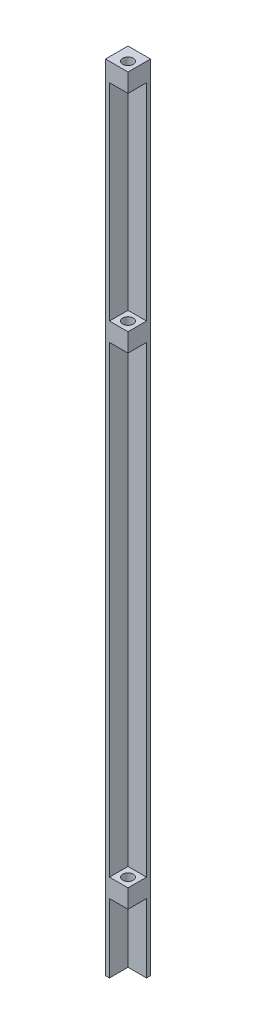
ISO-10303-21;
HEADER;
FILE_DESCRIPTION(('STEP AP214'),'2;1');
FILE_NAME('part.step','',(''),(''),'','','');
FILE_SCHEMA(('AUTOMOTIVE_DESIGN { 1 0 10303 214 1 1 1 1 }'));
ENDSEC;
DATA;
#1=APPLICATION_CONTEXT('core data for automotive mechanical design processes');
#2=APPLICATION_PROTOCOL_DEFINITION('international standard','automotive_design',2000,#1);
#3=PRODUCT_CONTEXT('',#1,'mechanical');
#4=PRODUCT('Part','Part','',(#3));
#5=PRODUCT_RELATED_PRODUCT_CATEGORY('part','',(#4));
#6=PRODUCT_DEFINITION_FORMATION('','',#4);
#7=PRODUCT_DEFINITION_CONTEXT('part definition',#1,'design');
#8=PRODUCT_DEFINITION('design','',#6,#7);
#9=PRODUCT_DEFINITION_SHAPE('','',#8);
#10=(LENGTH_UNIT() NAMED_UNIT(*) SI_UNIT(.MILLI.,.METRE.));
#11=(NAMED_UNIT(*) PLANE_ANGLE_UNIT() SI_UNIT($,.RADIAN.));
#12=(NAMED_UNIT(*) SI_UNIT($,.STERADIAN.) SOLID_ANGLE_UNIT());
#13=UNCERTAINTY_MEASURE_WITH_UNIT(LENGTH_MEASURE(1.E-05),#10,'distance_accuracy_value','');
#14=(GEOMETRIC_REPRESENTATION_CONTEXT(3) GLOBAL_UNCERTAINTY_ASSIGNED_CONTEXT((#13)) GLOBAL_UNIT_ASSIGNED_CONTEXT((#10,
#11,#12)) REPRESENTATION_CONTEXT('',''));
#15=CARTESIAN_POINT('',(0.,0.,0.));
#16=DIRECTION('',(0.,0.,1.));
#17=DIRECTION('',(1.,0.,0.));
#18=AXIS2_PLACEMENT_3D('',#15,#16,#17);
#19=CARTESIAN_POINT('',(1.5,215.,0.));
#20=DIRECTION('',(-1.,0.,0.));
#21=DIRECTION('',(0.,0.,1.));
#22=AXIS2_PLACEMENT_3D('',#19,#20,#21);
#23=PLANE('',#22);
#24=DIRECTION('',(0.,0.,1.));
#25=VECTOR('',#24,1.);
#26=CARTESIAN_POINT('',(1.5,293.,-7.));
#27=LINE('',#26,#25);
#28=CARTESIAN_POINT('',(1.5,293.,-7.));
#29=VERTEX_POINT('',#28);
#30=CARTESIAN_POINT('',(1.5,293.,0.));
#31=VERTEX_POINT('',#30);
#32=EDGE_CURVE('E53',#29,#31,#27,.T.);
#33=ORIENTED_EDGE('',*,*,#32,.T.);
#34=DIRECTION('',(0.,1.,0.));
#35=VECTOR('',#34,1.);
#36=CARTESIAN_POINT('',(1.5,215.,0.));
#37=LINE('',#36,#35);
#38=CARTESIAN_POINT('',(1.5,215.,0.));
#39=VERTEX_POINT('',#38);
#40=EDGE_CURVE('E165',#39,#31,#37,.T.);
#41=ORIENTED_EDGE('',*,*,#40,.F.);
#42=DIRECTION('',(0.,0.,1.));
#43=VECTOR('',#42,1.);
#44=CARTESIAN_POINT('',(1.5,215.,0.));
#45=LINE('',#44,#43);
#46=CARTESIAN_POINT('',(1.5,215.,-7.));
#47=VERTEX_POINT('',#46);
#48=EDGE_CURVE('E177',#47,#39,#45,.T.);
#49=ORIENTED_EDGE('',*,*,#48,.F.);
#50=DIRECTION('',(0.,1.,0.));
#51=VECTOR('',#50,1.);
#52=CARTESIAN_POINT('',(1.5,215.,-7.));
#53=LINE('',#52,#51);
#54=EDGE_CURVE('E183',#47,#29,#53,.T.);
#55=ORIENTED_EDGE('',*,*,#54,.T.);
#56=EDGE_LOOP('',(#33,#41,#49,#55));
#57=FACE_BOUND('',#56,.T.);
#58=ADVANCED_FACE('F37',(#57),#23,.F.);
#59=CARTESIAN_POINT('',(8.5,215.,-7.));
#60=DIRECTION('',(0.,0.,-1.));
#61=DIRECTION('',(-1.,0.,0.));
#62=AXIS2_PLACEMENT_3D('',#59,#60,#61);
#63=PLANE('',#62);
#64=DIRECTION('',(-1.,0.,0.));
#65=VECTOR('',#64,1.);
#66=CARTESIAN_POINT('',(1.5,293.,-7.));
#67=LINE('',#66,#65);
#68=CARTESIAN_POINT('',(8.5,293.,-7.));
#69=VERTEX_POINT('',#68);
#70=EDGE_CURVE('E156',#69,#29,#67,.T.);
#71=ORIENTED_EDGE('',*,*,#70,.T.);
#72=ORIENTED_EDGE('',*,*,#54,.F.);
#73=DIRECTION('',(-1.,0.,0.));
#74=VECTOR('',#73,1.);
#75=CARTESIAN_POINT('',(8.5,215.,-7.));
#76=LINE('',#75,#74);
#77=CARTESIAN_POINT('',(8.5,215.,-7.));
#78=VERTEX_POINT('',#77);
#79=EDGE_CURVE('E174',#78,#47,#76,.T.);
#80=ORIENTED_EDGE('',*,*,#79,.F.);
#81=DIRECTION('',(0.,1.,0.));
#82=VECTOR('',#81,1.);
#83=CARTESIAN_POINT('',(8.5,215.,-7.));
#84=LINE('',#83,#82);
#85=EDGE_CURVE('E61',#78,#69,#84,.T.);
#86=ORIENTED_EDGE('',*,*,#85,.T.);
#87=EDGE_LOOP('',(#71,#72,#80,#86));
#88=FACE_BOUND('',#87,.T.);
#89=ADVANCED_FACE('F320',(#88),#63,.F.);
#90=CARTESIAN_POINT('',(5.,218.,-3.5));
#91=DIRECTION('',(0.,-1.,0.));
#92=DIRECTION('',(0.,0.,-1.));
#93=AXIS2_PLACEMENT_3D('',#90,#91,#92);
#94=CYLINDRICAL_SURFACE('',#93,2.);
#95=CARTESIAN_POINT('',(5.,208.,-3.5));
#96=DIRECTION('',(0.,-1.,0.));
#97=DIRECTION('',(0.,0.,-1.));
#98=AXIS2_PLACEMENT_3D('',#95,#96,#97);
#99=CIRCLE('',#98,2.);
#100=CARTESIAN_POINT('',(5.,208.,-5.5));
#101=VERTEX_POINT('',#100);
#102=EDGE_CURVE('E212',#101,#101,#99,.T.);
#103=ORIENTED_EDGE('',*,*,#102,.T.);
#104=EDGE_LOOP('',(#103));
#105=FACE_BOUND('',#104,.T.);
#106=CARTESIAN_POINT('',(5.,215.,-3.5));
#107=DIRECTION('',(0.,1.,0.));
#108=DIRECTION('',(0.,0.,1.));
#109=AXIS2_PLACEMENT_3D('',#106,#107,#108);
#110=CIRCLE('',#109,2.);
#111=CARTESIAN_POINT('',(5.,215.,-1.5));
#112=VERTEX_POINT('',#111);
#113=EDGE_CURVE('E41',#112,#112,#110,.F.);
#114=ORIENTED_EDGE('',*,*,#113,.F.);
#115=EDGE_LOOP('',(#114));
#116=FACE_BOUND('',#115,.T.);
#117=ADVANCED_FACE('F325',(#105,#116),#94,.F.);
#118=CARTESIAN_POINT('',(0.,300.,0.));
#119=DIRECTION('',(1.,0.,0.));
#120=DIRECTION('',(0.,0.,-1.));
#121=AXIS2_PLACEMENT_3D('',#118,#119,#120);
#122=PLANE('',#121);
#123=DIRECTION('',(0.,0.,1.));
#124=VECTOR('',#123,1.);
#125=CARTESIAN_POINT('',(0.,0.,0.));
#126=LINE('',#125,#124);
#127=CARTESIAN_POINT('',(0.,0.,-8.5));
#128=VERTEX_POINT('',#127);
#129=CARTESIAN_POINT('',(0.,0.,0.));
#130=VERTEX_POINT('',#129);
#131=EDGE_CURVE('E246',#128,#130,#126,.T.);
#132=ORIENTED_EDGE('',*,*,#131,.T.);
#133=DIRECTION('',(0.,-1.,0.));
#134=VECTOR('',#133,1.);
#135=CARTESIAN_POINT('',(0.,300.,0.));
#136=LINE('',#135,#134);
#137=CARTESIAN_POINT('',(0.,300.,0.));
#138=VERTEX_POINT('',#137);
#139=EDGE_CURVE('E11',#138,#130,#136,.T.);
#140=ORIENTED_EDGE('',*,*,#139,.F.);
#141=DIRECTION('',(0.,0.,1.));
#142=VECTOR('',#141,1.);
#143=CARTESIAN_POINT('',(0.,300.,0.));
#144=LINE('',#143,#142);
#145=CARTESIAN_POINT('',(0.,300.,-8.5));
#146=VERTEX_POINT('',#145);
#147=EDGE_CURVE('E250',#146,#138,#144,.T.);
#148=ORIENTED_EDGE('',*,*,#147,.F.);
#149=DIRECTION('',(0.,-1.,0.));
#150=VECTOR('',#149,1.);
#151=CARTESIAN_POINT('',(0.,300.,-8.5));
#152=LINE('',#151,#150);
#153=EDGE_CURVE('E259',#146,#128,#152,.T.);
#154=ORIENTED_EDGE('',*,*,#153,.T.);
#155=EDGE_LOOP('',(#132,#140,#148,#154));
#156=FACE_BOUND('',#155,.T.);
#157=ADVANCED_FACE('F39',(#156),#122,.F.);
#158=CARTESIAN_POINT('',(0.,300.,0.));
#159=DIRECTION('',(0.,0.,-1.));
#160=DIRECTION('',(-1.,0.,0.));
#161=AXIS2_PLACEMENT_3D('',#158,#159,#160);
#162=PLANE('',#161);
#163=DIRECTION('',(1.,0.,0.));
#164=VECTOR('',#163,1.);
#165=CARTESIAN_POINT('',(8.5,215.,0.));
#166=LINE('',#165,#164);
#167=CARTESIAN_POINT('',(8.5,215.,0.));
#168=VERTEX_POINT('',#167);
#169=EDGE_CURVE('E180',#39,#168,#166,.T.);
#170=ORIENTED_EDGE('',*,*,#169,.F.);
#171=ORIENTED_EDGE('',*,*,#40,.T.);
#172=DIRECTION('',(1.,0.,0.));
#173=VECTOR('',#172,1.);
#174=CARTESIAN_POINT('',(1.5,293.,0.));
#175=LINE('',#174,#173);
#176=CARTESIAN_POINT('',(8.5,293.,0.));
#177=VERTEX_POINT('',#176);
#178=EDGE_CURVE('E161',#31,#177,#175,.T.);
#179=ORIENTED_EDGE('',*,*,#178,.T.);
#180=DIRECTION('',(0.,1.,0.));
#181=VECTOR('',#180,1.);
#182=CARTESIAN_POINT('',(8.5,293.,0.));
#183=LINE('',#182,#181);
#184=CARTESIAN_POINT('',(8.5,300.,0.));
#185=VERTEX_POINT('',#184);
#186=EDGE_CURVE('E146',#177,#185,#183,.T.);
#187=ORIENTED_EDGE('',*,*,#186,.T.);
#188=DIRECTION('',(1.,0.,0.));
#189=VECTOR('',#188,1.);
#190=CARTESIAN_POINT('',(0.,300.,0.));
#191=LINE('',#190,#189);
#192=EDGE_CURVE('E253',#138,#185,#191,.T.);
#193=ORIENTED_EDGE('',*,*,#192,.F.);
#194=ORIENTED_EDGE('',*,*,#139,.T.);
#195=DIRECTION('',(1.,0.,0.));
#196=VECTOR('',#195,1.);
#197=CARTESIAN_POINT('',(0.,0.,0.));
#198=LINE('',#197,#196);
#199=CARTESIAN_POINT('',(1.5,0.,0.));
#200=VERTEX_POINT('',#199);
#201=EDGE_CURVE('E262',#130,#200,#198,.T.);
#202=ORIENTED_EDGE('',*,*,#201,.T.);
#203=DIRECTION('',(0.,-1.,0.));
#204=VECTOR('',#203,1.);
#205=CARTESIAN_POINT('',(1.5,26.,0.));
#206=LINE('',#205,#204);
#207=CARTESIAN_POINT('',(1.5,26.,0.));
#208=VERTEX_POINT('',#207);
#209=EDGE_CURVE('E205',#208,#200,#206,.T.);
#210=ORIENTED_EDGE('',*,*,#209,.F.);
#211=DIRECTION('',(-1.,0.,0.));
#212=VECTOR('',#211,1.);
#213=CARTESIAN_POINT('',(8.5,26.,0.));
#214=LINE('',#213,#212);
#215=CARTESIAN_POINT('',(8.5,26.,0.));
#216=VERTEX_POINT('',#215);
#217=EDGE_CURVE('E195',#216,#208,#214,.T.);
#218=ORIENTED_EDGE('',*,*,#217,.F.);
#219=DIRECTION('',(0.,-1.,0.));
#220=VECTOR('',#219,1.);
#221=CARTESIAN_POINT('',(8.5,300.,0.));
#222=LINE('',#221,#220);
#223=CARTESIAN_POINT('',(8.5,33.,0.));
#224=VERTEX_POINT('',#223);
#225=EDGE_CURVE('E273',#224,#216,#222,.T.);
#226=ORIENTED_EDGE('',*,*,#225,.F.);
#227=DIRECTION('',(-1.,0.,0.));
#228=VECTOR('',#227,1.);
#229=CARTESIAN_POINT('',(8.5,33.,0.));
#230=LINE('',#229,#228);
#231=CARTESIAN_POINT('',(1.5,33.,0.));
#232=VERTEX_POINT('',#231);
#233=EDGE_CURVE('E235',#224,#232,#230,.T.);
#234=ORIENTED_EDGE('',*,*,#233,.T.);
#235=DIRECTION('',(0.,-1.,0.));
#236=VECTOR('',#235,1.);
#237=CARTESIAN_POINT('',(1.5,208.,0.));
#238=LINE('',#237,#236);
#239=CARTESIAN_POINT('',(1.5,208.,0.));
#240=VERTEX_POINT('',#239);
#241=EDGE_CURVE('E232',#240,#232,#238,.T.);
#242=ORIENTED_EDGE('',*,*,#241,.F.);
#243=DIRECTION('',(-1.,0.,0.));
#244=VECTOR('',#243,1.);
#245=CARTESIAN_POINT('',(8.5,208.,0.));
#246=LINE('',#245,#244);
#247=CARTESIAN_POINT('',(8.5,208.,0.));
#248=VERTEX_POINT('',#247);
#249=EDGE_CURVE('E222',#248,#240,#246,.T.);
#250=ORIENTED_EDGE('',*,*,#249,.F.);
#251=EDGE_CURVE('E46',#168,#248,#222,.T.);
#252=ORIENTED_EDGE('',*,*,#251,.F.);
#253=EDGE_LOOP('',(#170,#171,#179,#187,#193,#194,#202,#210,#218,#226,#234,#242,#250,#252));
#254=FACE_BOUND('',#253,.T.);
#255=ADVANCED_FACE('F164',(#254),#162,.F.);
#256=CARTESIAN_POINT('',(8.5,300.,0.));
#257=DIRECTION('',(-1.,0.,0.));
#258=DIRECTION('',(0.,0.,1.));
#259=AXIS2_PLACEMENT_3D('',#256,#257,#258);
#260=PLANE('',#259);
#261=DIRECTION('',(0.,0.,-1.));
#262=VECTOR('',#261,1.);
#263=CARTESIAN_POINT('',(8.5,300.,0.));
#264=LINE('',#263,#262);
#265=CARTESIAN_POINT('',(8.5,300.,-8.5));
#266=VERTEX_POINT('',#265);
#267=EDGE_CURVE('E152',#185,#266,#264,.T.);
#268=ORIENTED_EDGE('',*,*,#267,.F.);
#269=ORIENTED_EDGE('',*,*,#186,.F.);
#270=DIRECTION('',(0.,0.,-1.));
#271=VECTOR('',#270,1.);
#272=CARTESIAN_POINT('',(8.5,293.,-7.));
#273=LINE('',#272,#271);
#274=EDGE_CURVE('E149',#177,#69,#273,.T.);
#275=ORIENTED_EDGE('',*,*,#274,.T.);
#276=ORIENTED_EDGE('',*,*,#85,.F.);
#277=DIRECTION('',(0.,0.,-1.));
#278=VECTOR('',#277,1.);
#279=CARTESIAN_POINT('',(8.5,215.,0.));
#280=LINE('',#279,#278);
#281=EDGE_CURVE('E155',#168,#78,#280,.T.);
#282=ORIENTED_EDGE('',*,*,#281,.F.);
#283=ORIENTED_EDGE('',*,*,#251,.T.);
#284=DIRECTION('',(0.,0.,1.));
#285=VECTOR('',#284,1.);
#286=CARTESIAN_POINT('',(8.5,208.,0.));
#287=LINE('',#286,#285);
#288=CARTESIAN_POINT('',(8.5,208.,-7.));
#289=VERTEX_POINT('',#288);
#290=EDGE_CURVE('E219',#289,#248,#287,.T.);
#291=ORIENTED_EDGE('',*,*,#290,.F.);
#292=DIRECTION('',(0.,-1.,0.));
#293=VECTOR('',#292,1.);
#294=CARTESIAN_POINT('',(8.5,208.,-7.));
#295=LINE('',#294,#293);
#296=CARTESIAN_POINT('',(8.5,33.,-7.));
#297=VERTEX_POINT('',#296);
#298=EDGE_CURVE('E243',#289,#297,#295,.T.);
#299=ORIENTED_EDGE('',*,*,#298,.T.);
#300=DIRECTION('',(0.,0.,1.));
#301=VECTOR('',#300,1.);
#302=CARTESIAN_POINT('',(8.5,33.,0.));
#303=LINE('',#302,#301);
#304=EDGE_CURVE('E218',#297,#224,#303,.T.);
#305=ORIENTED_EDGE('',*,*,#304,.T.);
#306=ORIENTED_EDGE('',*,*,#225,.T.);
#307=DIRECTION('',(0.,0.,1.));
#308=VECTOR('',#307,1.);
#309=CARTESIAN_POINT('',(8.5,26.,0.));
#310=LINE('',#309,#308);
#311=CARTESIAN_POINT('',(8.5,26.,-7.));
#312=VERTEX_POINT('',#311);
#313=EDGE_CURVE('E193',#312,#216,#310,.T.);
#314=ORIENTED_EDGE('',*,*,#313,.F.);
#315=DIRECTION('',(0.,-1.,0.));
#316=VECTOR('',#315,1.);
#317=CARTESIAN_POINT('',(8.5,26.,-7.));
#318=LINE('',#317,#316);
#319=CARTESIAN_POINT('',(8.5,0.,-7.));
#320=VERTEX_POINT('',#319);
#321=EDGE_CURVE('E209',#312,#320,#318,.T.);
#322=ORIENTED_EDGE('',*,*,#321,.T.);
#323=DIRECTION('',(0.,0.,-1.));
#324=VECTOR('',#323,1.);
#325=CARTESIAN_POINT('',(8.5,0.,0.));
#326=LINE('',#325,#324);
#327=CARTESIAN_POINT('',(8.5,0.,-8.5));
#328=VERTEX_POINT('',#327);
#329=EDGE_CURVE('E265',#320,#328,#326,.T.);
#330=ORIENTED_EDGE('',*,*,#329,.T.);
#331=DIRECTION('',(0.,-1.,0.));
#332=VECTOR('',#331,1.);
#333=CARTESIAN_POINT('',(8.5,300.,-8.5));
#334=LINE('',#333,#332);
#335=EDGE_CURVE('E270',#266,#328,#334,.T.);
#336=ORIENTED_EDGE('',*,*,#335,.F.);
#337=EDGE_LOOP('',(#268,#269,#275,#276,#282,#283,#291,#299,#305,#306,#314,#322,#330,#336));
#338=FACE_BOUND('',#337,.T.);
#339=ADVANCED_FACE('F148',(#338),#260,.F.);
#340=CARTESIAN_POINT('',(0.,300.,-8.5));
#341=DIRECTION('',(0.,0.,1.));
#342=DIRECTION('',(1.,0.,0.));
#343=AXIS2_PLACEMENT_3D('',#340,#341,#342);
#344=PLANE('',#343);
#345=DIRECTION('',(-1.,0.,0.));
#346=VECTOR('',#345,1.);
#347=CARTESIAN_POINT('',(0.,0.,-8.5));
#348=LINE('',#347,#346);
#349=EDGE_CURVE('E254',#328,#128,#348,.T.);
#350=ORIENTED_EDGE('',*,*,#349,.T.);
#351=ORIENTED_EDGE('',*,*,#153,.F.);
#352=DIRECTION('',(-1.,0.,0.));
#353=VECTOR('',#352,1.);
#354=CARTESIAN_POINT('',(0.,300.,-8.5));
#355=LINE('',#354,#353);
#356=EDGE_CURVE('E257',#266,#146,#355,.T.);
#357=ORIENTED_EDGE('',*,*,#356,.F.);
#358=ORIENTED_EDGE('',*,*,#335,.T.);
#359=EDGE_LOOP('',(#350,#351,#357,#358));
#360=FACE_BOUND('',#359,.T.);
#361=ADVANCED_FACE('F297',(#360),#344,.F.);
#362=CARTESIAN_POINT('',(0.,300.,0.));
#363=DIRECTION('',(0.,-1.,0.));
#364=DIRECTION('',(0.,0.,-1.));
#365=AXIS2_PLACEMENT_3D('',#362,#363,#364);
#366=PLANE('',#365);
#367=ORIENTED_EDGE('',*,*,#192,.T.);
#368=ORIENTED_EDGE('',*,*,#267,.T.);
#369=ORIENTED_EDGE('',*,*,#356,.T.);
#370=ORIENTED_EDGE('',*,*,#147,.T.);
#371=EDGE_LOOP('',(#367,#368,#369,#370));
#372=FACE_BOUND('',#371,.T.);
#373=CARTESIAN_POINT('',(5.,300.,-3.5));
#374=DIRECTION('',(0.,1.,0.));
#375=DIRECTION('',(0.,0.,1.));
#376=AXIS2_PLACEMENT_3D('',#373,#374,#375);
#377=CIRCLE('',#376,2.);
#378=CARTESIAN_POINT('',(5.,300.,-1.5));
#379=VERTEX_POINT('',#378);
#380=EDGE_CURVE('E440',#379,#379,#377,.T.);
#381=ORIENTED_EDGE('',*,*,#380,.F.);
#382=EDGE_LOOP('',(#381));
#383=FACE_BOUND('',#382,.T.);
#384=ADVANCED_FACE('F303',(#372,#383),#366,.F.);
#385=CARTESIAN_POINT('',(0.,0.,0.));
#386=DIRECTION('',(0.,-1.,0.));
#387=DIRECTION('',(0.,0.,-1.));
#388=AXIS2_PLACEMENT_3D('',#385,#386,#387);
#389=PLANE('',#388);
#390=DIRECTION('',(1.,0.,0.));
#391=VECTOR('',#390,1.);
#392=CARTESIAN_POINT('',(8.5,0.,-7.));
#393=LINE('',#392,#391);
#394=CARTESIAN_POINT('',(1.5,0.,-7.));
#395=VERTEX_POINT('',#394);
#396=EDGE_CURVE('E196',#395,#320,#393,.T.);
#397=ORIENTED_EDGE('',*,*,#396,.F.);
#398=DIRECTION('',(0.,0.,-1.));
#399=VECTOR('',#398,1.);
#400=CARTESIAN_POINT('',(1.5,0.,0.));
#401=LINE('',#400,#399);
#402=EDGE_CURVE('E192',#200,#395,#401,.T.);
#403=ORIENTED_EDGE('',*,*,#402,.F.);
#404=ORIENTED_EDGE('',*,*,#201,.F.);
#405=ORIENTED_EDGE('',*,*,#131,.F.);
#406=ORIENTED_EDGE('',*,*,#349,.F.);
#407=ORIENTED_EDGE('',*,*,#329,.F.);
#408=EDGE_LOOP('',(#397,#403,#404,#405,#406,#407));
#409=FACE_BOUND('',#408,.T.);
#410=ADVANCED_FACE('F292',(#409),#389,.T.);
#411=CARTESIAN_POINT('',(8.5,208.,-7.));
#412=DIRECTION('',(0.,0.,-1.));
#413=DIRECTION('',(-1.,0.,0.));
#414=AXIS2_PLACEMENT_3D('',#411,#412,#413);
#415=PLANE('',#414);
#416=DIRECTION('',(1.,0.,0.));
#417=VECTOR('',#416,1.);
#418=CARTESIAN_POINT('',(8.5,33.,-7.));
#419=LINE('',#418,#417);
#420=CARTESIAN_POINT('',(1.5,33.,-7.));
#421=VERTEX_POINT('',#420);
#422=EDGE_CURVE('E223',#421,#297,#419,.T.);
#423=ORIENTED_EDGE('',*,*,#422,.T.);
#424=ORIENTED_EDGE('',*,*,#298,.F.);
#425=DIRECTION('',(1.,0.,0.));
#426=VECTOR('',#425,1.);
#427=CARTESIAN_POINT('',(8.5,208.,-7.));
#428=LINE('',#427,#426);
#429=CARTESIAN_POINT('',(1.5,208.,-7.));
#430=VERTEX_POINT('',#429);
#431=EDGE_CURVE('E229',#430,#289,#428,.T.);
#432=ORIENTED_EDGE('',*,*,#431,.F.);
#433=DIRECTION('',(0.,-1.,0.));
#434=VECTOR('',#433,1.);
#435=CARTESIAN_POINT('',(1.5,208.,-7.));
#436=LINE('',#435,#434);
#437=EDGE_CURVE('E247',#430,#421,#436,.T.);
#438=ORIENTED_EDGE('',*,*,#437,.T.);
#439=EDGE_LOOP('',(#423,#424,#432,#438));
#440=FACE_BOUND('',#439,.T.);
#441=ADVANCED_FACE('F348',(#440),#415,.F.);
#442=CARTESIAN_POINT('',(1.5,208.,0.));
#443=DIRECTION('',(-1.,0.,0.));
#444=DIRECTION('',(0.,0.,1.));
#445=AXIS2_PLACEMENT_3D('',#442,#443,#444);
#446=PLANE('',#445);
#447=DIRECTION('',(0.,0.,-1.));
#448=VECTOR('',#447,1.);
#449=CARTESIAN_POINT('',(1.5,33.,0.));
#450=LINE('',#449,#448);
#451=EDGE_CURVE('E238',#232,#421,#450,.T.);
#452=ORIENTED_EDGE('',*,*,#451,.T.);
#453=ORIENTED_EDGE('',*,*,#437,.F.);
#454=DIRECTION('',(0.,0.,-1.));
#455=VECTOR('',#454,1.);
#456=CARTESIAN_POINT('',(1.5,208.,0.));
#457=LINE('',#456,#455);
#458=EDGE_CURVE('E226',#240,#430,#457,.T.);
#459=ORIENTED_EDGE('',*,*,#458,.F.);
#460=ORIENTED_EDGE('',*,*,#241,.T.);
#461=EDGE_LOOP('',(#452,#453,#459,#460));
#462=FACE_BOUND('',#461,.T.);
#463=ADVANCED_FACE('F353',(#462),#446,.F.);
#464=CARTESIAN_POINT('',(0.,208.,0.));
#465=DIRECTION('',(0.,1.,0.));
#466=DIRECTION('',(0.,0.,1.));
#467=AXIS2_PLACEMENT_3D('',#464,#465,#466);
#468=PLANE('',#467);
#469=ORIENTED_EDGE('',*,*,#102,.F.);
#470=EDGE_LOOP('',(#469));
#471=FACE_BOUND('',#470,.T.);
#472=ORIENTED_EDGE('',*,*,#290,.T.);
#473=ORIENTED_EDGE('',*,*,#249,.T.);
#474=ORIENTED_EDGE('',*,*,#458,.T.);
#475=ORIENTED_EDGE('',*,*,#431,.T.);
#476=EDGE_LOOP('',(#472,#473,#474,#475));
#477=FACE_BOUND('',#476,.T.);
#478=ADVANCED_FACE('F343',(#471,#477),#468,.F.);
#479=CARTESIAN_POINT('',(0.,33.,0.));
#480=DIRECTION('',(0.,1.,0.));
#481=DIRECTION('',(0.,0.,1.));
#482=AXIS2_PLACEMENT_3D('',#479,#480,#481);
#483=PLANE('',#482);
#484=CARTESIAN_POINT('',(5.,33.,-3.5));
#485=DIRECTION('',(0.,1.,0.));
#486=DIRECTION('',(0.,0.,1.));
#487=AXIS2_PLACEMENT_3D('',#484,#485,#486);
#488=CIRCLE('',#487,2.);
#489=CARTESIAN_POINT('',(5.,33.,-5.5));
#490=VERTEX_POINT('',#489);
#491=EDGE_CURVE('E189',#490,#490,#488,.T.);
#492=ORIENTED_EDGE('',*,*,#491,.F.);
#493=EDGE_LOOP('',(#492));
#494=FACE_BOUND('',#493,.T.);
#495=ORIENTED_EDGE('',*,*,#304,.F.);
#496=ORIENTED_EDGE('',*,*,#422,.F.);
#497=ORIENTED_EDGE('',*,*,#451,.F.);
#498=ORIENTED_EDGE('',*,*,#233,.F.);
#499=EDGE_LOOP('',(#495,#496,#497,#498));
#500=FACE_BOUND('',#499,.T.);
#501=ADVANCED_FACE('F316',(#494,#500),#483,.T.);
#502=CARTESIAN_POINT('',(8.5,26.,-7.));
#503=DIRECTION('',(0.,0.,-1.));
#504=DIRECTION('',(-1.,0.,0.));
#505=AXIS2_PLACEMENT_3D('',#502,#503,#504);
#506=PLANE('',#505);
#507=ORIENTED_EDGE('',*,*,#396,.T.);
#508=ORIENTED_EDGE('',*,*,#321,.F.);
#509=DIRECTION('',(1.,0.,0.));
#510=VECTOR('',#509,1.);
#511=CARTESIAN_POINT('',(8.5,26.,-7.));
#512=LINE('',#511,#510);
#513=CARTESIAN_POINT('',(1.5,26.,-7.));
#514=VERTEX_POINT('',#513);
#515=EDGE_CURVE('E202',#514,#312,#512,.T.);
#516=ORIENTED_EDGE('',*,*,#515,.F.);
#517=DIRECTION('',(0.,-1.,0.));
#518=VECTOR('',#517,1.);
#519=CARTESIAN_POINT('',(1.5,26.,-7.));
#520=LINE('',#519,#518);
#521=EDGE_CURVE('E213',#514,#395,#520,.T.);
#522=ORIENTED_EDGE('',*,*,#521,.T.);
#523=EDGE_LOOP('',(#507,#508,#516,#522));
#524=FACE_BOUND('',#523,.T.);
#525=ADVANCED_FACE('F287',(#524),#506,.F.);
#526=CARTESIAN_POINT('',(1.5,26.,0.));
#527=DIRECTION('',(-1.,0.,0.));
#528=DIRECTION('',(0.,0.,1.));
#529=AXIS2_PLACEMENT_3D('',#526,#527,#528);
#530=PLANE('',#529);
#531=ORIENTED_EDGE('',*,*,#402,.T.);
#532=ORIENTED_EDGE('',*,*,#521,.F.);
#533=DIRECTION('',(0.,0.,-1.));
#534=VECTOR('',#533,1.);
#535=CARTESIAN_POINT('',(1.5,26.,0.));
#536=LINE('',#535,#534);
#537=EDGE_CURVE('E199',#208,#514,#536,.T.);
#538=ORIENTED_EDGE('',*,*,#537,.F.);
#539=ORIENTED_EDGE('',*,*,#209,.T.);
#540=EDGE_LOOP('',(#531,#532,#538,#539));
#541=FACE_BOUND('',#540,.T.);
#542=ADVANCED_FACE('F306',(#541),#530,.F.);
#543=CARTESIAN_POINT('',(0.,26.,0.));
#544=DIRECTION('',(0.,1.,0.));
#545=DIRECTION('',(0.,0.,1.));
#546=AXIS2_PLACEMENT_3D('',#543,#544,#545);
#547=PLANE('',#546);
#548=CARTESIAN_POINT('',(5.,26.,-3.5));
#549=DIRECTION('',(0.,-1.,0.));
#550=DIRECTION('',(0.,0.,-1.));
#551=AXIS2_PLACEMENT_3D('',#548,#549,#550);
#552=CIRCLE('',#551,2.);
#553=CARTESIAN_POINT('',(5.,26.,-5.5));
#554=VERTEX_POINT('',#553);
#555=EDGE_CURVE('E186',#554,#554,#552,.T.);
#556=ORIENTED_EDGE('',*,*,#555,.F.);
#557=EDGE_LOOP('',(#556));
#558=FACE_BOUND('',#557,.T.);
#559=ORIENTED_EDGE('',*,*,#313,.T.);
#560=ORIENTED_EDGE('',*,*,#217,.T.);
#561=ORIENTED_EDGE('',*,*,#537,.T.);
#562=ORIENTED_EDGE('',*,*,#515,.T.);
#563=EDGE_LOOP('',(#559,#560,#561,#562));
#564=FACE_BOUND('',#563,.T.);
#565=ADVANCED_FACE('F284',(#558,#564),#547,.F.);
#566=CARTESIAN_POINT('',(5.,52.,-3.5));
#567=DIRECTION('',(0.,-1.,0.));
#568=DIRECTION('',(0.,0.,-1.));
#569=AXIS2_PLACEMENT_3D('',#566,#567,#568);
#570=CYLINDRICAL_SURFACE('',#569,2.);
#571=CARTESIAN_POINT('',(5.,33.,-5.5));
#572=CARTESIAN_POINT('',(5.,32.9270833333333,-5.5));
#573=CARTESIAN_POINT('',(5.,32.8541666666667,-5.5));
#574=CARTESIAN_POINT('',(5.,32.7083333333333,-5.5));
#575=CARTESIAN_POINT('',(5.,32.6354166666667,-5.5));
#576=CARTESIAN_POINT('',(5.,32.4895833333333,-5.5));
#577=CARTESIAN_POINT('',(5.,32.4166666666667,-5.5));
#578=CARTESIAN_POINT('',(5.,32.2708333333333,-5.5));
#579=CARTESIAN_POINT('',(5.,32.1979166666667,-5.5));
#580=CARTESIAN_POINT('',(5.,32.0520833333333,-5.5));
#581=CARTESIAN_POINT('',(5.,31.9791666666667,-5.5));
#582=CARTESIAN_POINT('',(5.,31.8333333333333,-5.5));
#583=CARTESIAN_POINT('',(5.,31.7604166666667,-5.5));
#584=CARTESIAN_POINT('',(5.,31.6145833333333,-5.5));
#585=CARTESIAN_POINT('',(5.,31.5416666666667,-5.5));
#586=CARTESIAN_POINT('',(5.,31.3958333333333,-5.5));
#587=CARTESIAN_POINT('',(5.,31.3229166666667,-5.5));
#588=CARTESIAN_POINT('',(5.,31.1770833333333,-5.5));
#589=CARTESIAN_POINT('',(5.,31.1041666666667,-5.5));
#590=CARTESIAN_POINT('',(5.,30.9583333333333,-5.5));
#591=CARTESIAN_POINT('',(5.,30.8854166666667,-5.5));
#592=CARTESIAN_POINT('',(5.,30.7395833333333,-5.5));
#593=CARTESIAN_POINT('',(5.,30.6666666666667,-5.5));
#594=CARTESIAN_POINT('',(5.,30.5208333333333,-5.5));
#595=CARTESIAN_POINT('',(5.,30.4479166666667,-5.5));
#596=CARTESIAN_POINT('',(5.,30.3020833333333,-5.5));
#597=CARTESIAN_POINT('',(5.,30.2291666666667,-5.5));
#598=CARTESIAN_POINT('',(5.,30.0833333333333,-5.5));
#599=CARTESIAN_POINT('',(5.,30.0104166666667,-5.5));
#600=CARTESIAN_POINT('',(5.,29.8645833333333,-5.5));
#601=CARTESIAN_POINT('',(5.,29.7916666666667,-5.5));
#602=CARTESIAN_POINT('',(5.,29.6458333333333,-5.5));
#603=CARTESIAN_POINT('',(5.,29.5729166666667,-5.5));
#604=CARTESIAN_POINT('',(5.,29.4270833333333,-5.5));
#605=CARTESIAN_POINT('',(5.,29.3541666666667,-5.5));
#606=CARTESIAN_POINT('',(5.,29.2083333333333,-5.5));
#607=CARTESIAN_POINT('',(5.,29.1354166666667,-5.5));
#608=CARTESIAN_POINT('',(5.,28.9895833333333,-5.5));
#609=CARTESIAN_POINT('',(5.,28.9166666666667,-5.5));
#610=CARTESIAN_POINT('',(5.,28.7708333333333,-5.5));
#611=CARTESIAN_POINT('',(5.,28.6979166666667,-5.5));
#612=CARTESIAN_POINT('',(5.,28.5520833333333,-5.5));
#613=CARTESIAN_POINT('',(5.,28.4791666666667,-5.5));
#614=CARTESIAN_POINT('',(5.,28.3333333333333,-5.5));
#615=CARTESIAN_POINT('',(5.,28.2604166666667,-5.5));
#616=CARTESIAN_POINT('',(5.,28.1145833333333,-5.5));
#617=CARTESIAN_POINT('',(5.,28.0416666666667,-5.5));
#618=CARTESIAN_POINT('',(5.,27.8958333333333,-5.5));
#619=CARTESIAN_POINT('',(5.,27.8229166666667,-5.5));
#620=CARTESIAN_POINT('',(5.,27.6770833333333,-5.5));
#621=CARTESIAN_POINT('',(5.,27.6041666666667,-5.5));
#622=CARTESIAN_POINT('',(5.,27.4583333333333,-5.5));
#623=CARTESIAN_POINT('',(5.,27.3854166666667,-5.5));
#624=CARTESIAN_POINT('',(5.,27.2395833333333,-5.5));
#625=CARTESIAN_POINT('',(5.,27.1666666666667,-5.5));
#626=CARTESIAN_POINT('',(5.,27.0208333333333,-5.5));
#627=CARTESIAN_POINT('',(5.,26.9479166666667,-5.5));
#628=CARTESIAN_POINT('',(5.,26.8020833333333,-5.5));
#629=CARTESIAN_POINT('',(5.,26.7291666666667,-5.5));
#630=CARTESIAN_POINT('',(5.,26.5833333333333,-5.5));
#631=CARTESIAN_POINT('',(5.,26.5104166666667,-5.5));
#632=CARTESIAN_POINT('',(5.,26.3645833333333,-5.5));
#633=CARTESIAN_POINT('',(5.,26.2916666666667,-5.5));
#634=CARTESIAN_POINT('',(5.,26.1458333333333,-5.5));
#635=CARTESIAN_POINT('',(5.,26.0729166666667,-5.5));
#636=CARTESIAN_POINT('',(5.,26.,-5.5));
#637=B_SPLINE_CURVE_WITH_KNOTS('',3,(#571,#572,#573,#574,#575,#576,#577,#578,#579,#580,#581,
#582,#583,#584,#585,#586,#587,#588,#589,#590,#591,#592,#593,#594,#595,#596,#597,#598,#599,#600,
#601,#602,#603,#604,#605,#606,#607,#608,#609,#610,#611,#612,#613,#614,#615,#616,#617,#618,#619,
#620,#621,#622,#623,#624,#625,#626,#627,#628,#629,#630,#631,#632,#633,#634,#635,#636),
.UNSPECIFIED.,.F.,.F.,(4,2,2,2,2,2,2,2,2,2,2,2,2,2,2,2,2,2,2,2,2,2,2,2,2,2,2,2,2,2,2,2,4),(0.,
0.218750000000004,0.437500000000007,0.656250000000004,0.875000000000001,1.09375,
1.31250000000001,1.53125,1.75000000000001,1.96875,2.1875,2.40625,2.625,2.84375,3.0625,3.28125,
3.5,3.71875,3.9375,4.15625,4.375,4.59375,4.8125,5.03125,5.25,5.46875,5.6875,5.90625,6.125,
6.34375,6.5625,6.78125,7.),.UNSPECIFIED.);
#638=EDGE_CURVE('BSEAM313',#490,#554,#637,.T.);
#639=ORIENTED_EDGE('',*,*,#491,.T.);
#640=ORIENTED_EDGE('',*,*,#555,.T.);
#641=ORIENTED_EDGE('',*,*,#638,.T.);
#642=ORIENTED_EDGE('',*,*,#638,.F.);
#643=EDGE_LOOP('',(#639,#641,#640,#642));
#644=FACE_BOUND('',#643,.T.);
#645=ADVANCED_FACE('F313',(#644),#570,.F.);
#646=CARTESIAN_POINT('',(0.,215.,0.));
#647=DIRECTION('',(0.,1.,0.));
#648=DIRECTION('',(0.,0.,1.));
#649=AXIS2_PLACEMENT_3D('',#646,#647,#648);
#650=PLANE('',#649);
#651=ORIENTED_EDGE('',*,*,#281,.T.);
#652=ORIENTED_EDGE('',*,*,#79,.T.);
#653=ORIENTED_EDGE('',*,*,#48,.T.);
#654=ORIENTED_EDGE('',*,*,#169,.T.);
#655=EDGE_LOOP('',(#651,#652,#653,#654));
#656=FACE_BOUND('',#655,.T.);
#657=ORIENTED_EDGE('',*,*,#113,.T.);
#658=EDGE_LOOP('',(#657));
#659=FACE_BOUND('',#658,.T.);
#660=ADVANCED_FACE('F328',(#656,#659),#650,.T.);
#661=CARTESIAN_POINT('',(0.,293.,0.));
#662=DIRECTION('',(0.,1.,0.));
#663=DIRECTION('',(0.,0.,1.));
#664=AXIS2_PLACEMENT_3D('',#661,#662,#663);
#665=PLANE('',#664);
#666=CARTESIAN_POINT('',(5.,293.,-3.5));
#667=DIRECTION('',(0.,1.,0.));
#668=DIRECTION('',(0.,0.,1.));
#669=AXIS2_PLACEMENT_3D('',#666,#667,#668);
#670=CIRCLE('',#669,2.);
#671=CARTESIAN_POINT('',(5.,293.,-1.5));
#672=VERTEX_POINT('',#671);
#673=EDGE_CURVE('E167',#672,#672,#670,.T.);
#674=ORIENTED_EDGE('',*,*,#673,.T.);
#675=EDGE_LOOP('',(#674));
#676=FACE_BOUND('',#675,.T.);
#677=ORIENTED_EDGE('',*,*,#32,.F.);
#678=ORIENTED_EDGE('',*,*,#70,.F.);
#679=ORIENTED_EDGE('',*,*,#274,.F.);
#680=ORIENTED_EDGE('',*,*,#178,.F.);
#681=EDGE_LOOP('',(#677,#678,#679,#680));
#682=FACE_BOUND('',#681,.T.);
#683=ADVANCED_FACE('F160',(#676,#682),#665,.F.);
#684=CARTESIAN_POINT('',(5.,293.,-3.5));
#685=DIRECTION('',(0.,1.,0.));
#686=DIRECTION('',(0.,0.,1.));
#687=AXIS2_PLACEMENT_3D('',#684,#685,#686);
#688=CYLINDRICAL_SURFACE('',#687,2.);
#689=ORIENTED_EDGE('',*,*,#673,.F.);
#690=EDGE_LOOP('',(#689));
#691=FACE_BOUND('',#690,.T.);
#692=ORIENTED_EDGE('',*,*,#380,.T.);
#693=EDGE_LOOP('',(#692));
#694=FACE_BOUND('',#693,.T.);
#695=ADVANCED_FACE('F422',(#691,#694),#688,.F.);
#696=CLOSED_SHELL('',(#58,#89,#117,#157,#255,#339,#361,#384,#410,#441,#463,#478,#501,#525,#542,
#565,#645,#660,#683,#695));
#697=MANIFOLD_SOLID_BREP('B2',#696);
#698=ADVANCED_BREP_SHAPE_REPRESENTATION('',(#18,#697),#14);
#699=SHAPE_DEFINITION_REPRESENTATION(#9,#698);
ENDSEC;
END-ISO-10303-21;
